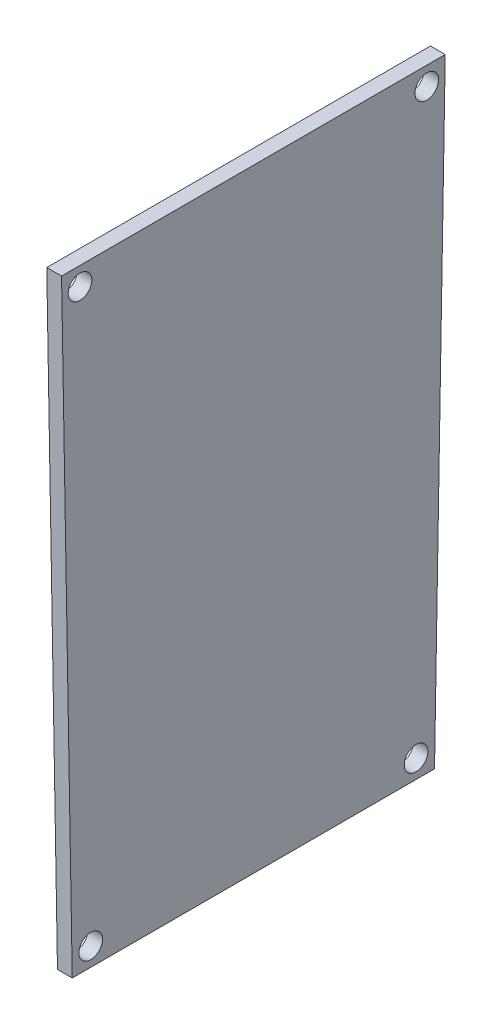
ISO-10303-21;
HEADER;
FILE_DESCRIPTION(('STEP AP214'),'2;1');
FILE_NAME('part.step','',(''),(''),'','','');
FILE_SCHEMA(('AUTOMOTIVE_DESIGN { 1 0 10303 214 1 1 1 1 }'));
ENDSEC;
DATA;
#1=APPLICATION_CONTEXT('core data for automotive mechanical design processes');
#2=APPLICATION_PROTOCOL_DEFINITION('international standard','automotive_design',2000,#1);
#3=PRODUCT_CONTEXT('',#1,'mechanical');
#4=PRODUCT('Part','Part','',(#3));
#5=PRODUCT_RELATED_PRODUCT_CATEGORY('part','',(#4));
#6=PRODUCT_DEFINITION_FORMATION('','',#4);
#7=PRODUCT_DEFINITION_CONTEXT('part definition',#1,'design');
#8=PRODUCT_DEFINITION('design','',#6,#7);
#9=PRODUCT_DEFINITION_SHAPE('','',#8);
#10=(LENGTH_UNIT() NAMED_UNIT(*) SI_UNIT(.MILLI.,.METRE.));
#11=(NAMED_UNIT(*) PLANE_ANGLE_UNIT() SI_UNIT($,.RADIAN.));
#12=(NAMED_UNIT(*) SI_UNIT($,.STERADIAN.) SOLID_ANGLE_UNIT());
#13=UNCERTAINTY_MEASURE_WITH_UNIT(LENGTH_MEASURE(1.E-05),#10,'distance_accuracy_value','');
#14=(GEOMETRIC_REPRESENTATION_CONTEXT(3) GLOBAL_UNCERTAINTY_ASSIGNED_CONTEXT((#13)) GLOBAL_UNIT_ASSIGNED_CONTEXT((#10,
#11,#12)) REPRESENTATION_CONTEXT('',''));
#15=CARTESIAN_POINT('',(0.,0.,0.));
#16=DIRECTION('',(0.,0.,1.));
#17=DIRECTION('',(1.,0.,0.));
#18=AXIS2_PLACEMENT_3D('',#15,#16,#17);
#19=CARTESIAN_POINT('',(50.7732847860139,110.032359225601,93.9540991206735));
#20=DIRECTION('',(0.,-0.0174524064372836,0.999847695156391));
#21=DIRECTION('',(0.,-0.999847695156391,-0.0174524064372836));
#22=AXIS2_PLACEMENT_3D('',#19,#20,#21);
#23=PLANE('',#22);
#24=DIRECTION('',(0.,-0.999847695156391,-0.0174524064372836));
#25=VECTOR('',#24,1.);
#26=CARTESIAN_POINT('',(52.7732847860139,110.032359225601,93.9540991206735));
#27=LINE('',#26,#25);
#28=CARTESIAN_POINT('',(52.7732847860139,110.032359225601,93.9540991206735));
#29=VERTEX_POINT('',#28);
#30=CARTESIAN_POINT('',(52.7732847860139,27.032359225601,92.5053287316314));
#31=VERTEX_POINT('',#30);
#32=EDGE_CURVE('E98',#29,#31,#27,.T.);
#33=ORIENTED_EDGE('',*,*,#32,.F.);
#34=DIRECTION('',(1.,0.,0.));
#35=VECTOR('',#34,1.);
#36=CARTESIAN_POINT('',(50.7732847860139,110.032359225601,93.9540991206735));
#37=LINE('',#36,#35);
#38=CARTESIAN_POINT('',(50.7732847860139,110.032359225601,93.9540991206735));
#39=VERTEX_POINT('',#38);
#40=EDGE_CURVE('E11',#39,#29,#37,.T.);
#41=ORIENTED_EDGE('',*,*,#40,.F.);
#42=DIRECTION('',(0.,-0.999847695156391,-0.0174524064372836));
#43=VECTOR('',#42,1.);
#44=CARTESIAN_POINT('',(50.7732847860139,110.032359225601,93.9540991206735));
#45=LINE('',#44,#43);
#46=CARTESIAN_POINT('',(50.7732847860139,27.032359225601,92.5053287316314));
#47=VERTEX_POINT('',#46);
#48=EDGE_CURVE('E91',#39,#47,#45,.T.);
#49=ORIENTED_EDGE('',*,*,#48,.T.);
#50=DIRECTION('',(1.,0.,0.));
#51=VECTOR('',#50,1.);
#52=CARTESIAN_POINT('',(50.7732847860139,27.032359225601,92.5053287316314));
#53=LINE('',#52,#51);
#54=EDGE_CURVE('E36',#47,#31,#53,.T.);
#55=ORIENTED_EDGE('',*,*,#54,.T.);
#56=EDGE_LOOP('',(#33,#41,#49,#55));
#57=FACE_BOUND('',#56,.T.);
#58=ADVANCED_FACE('F33',(#57),#23,.T.);
#59=CARTESIAN_POINT('',(50.7732847860139,110.032359225601,42.0251380047376));
#60=DIRECTION('',(0.,1.,0.));
#61=DIRECTION('',(0.,0.,1.));
#62=AXIS2_PLACEMENT_3D('',#59,#60,#61);
#63=PLANE('',#62);
#64=DIRECTION('',(0.,0.,1.));
#65=VECTOR('',#64,1.);
#66=CARTESIAN_POINT('',(52.7732847860139,110.032359225601,42.0251380047376));
#67=LINE('',#66,#65);
#68=CARTESIAN_POINT('',(52.7732847860139,110.032359225601,42.0251380047376));
#69=VERTEX_POINT('',#68);
#70=EDGE_CURVE('E93',#69,#29,#67,.T.);
#71=ORIENTED_EDGE('',*,*,#70,.F.);
#72=DIRECTION('',(1.,0.,0.));
#73=VECTOR('',#72,1.);
#74=CARTESIAN_POINT('',(50.7732847860139,110.032359225601,42.0251380047376));
#75=LINE('',#74,#73);
#76=CARTESIAN_POINT('',(50.7732847860139,110.032359225601,42.0251380047376));
#77=VERTEX_POINT('',#76);
#78=EDGE_CURVE('E42',#77,#69,#75,.T.);
#79=ORIENTED_EDGE('',*,*,#78,.F.);
#80=DIRECTION('',(0.,0.,1.));
#81=VECTOR('',#80,1.);
#82=CARTESIAN_POINT('',(50.7732847860139,110.032359225601,42.0251380047376));
#83=LINE('',#82,#81);
#84=EDGE_CURVE('E88',#77,#39,#83,.T.);
#85=ORIENTED_EDGE('',*,*,#84,.T.);
#86=ORIENTED_EDGE('',*,*,#40,.T.);
#87=EDGE_LOOP('',(#71,#79,#85,#86));
#88=FACE_BOUND('',#87,.T.);
#89=ADVANCED_FACE('F109',(#88),#63,.T.);
#90=CARTESIAN_POINT('',(50.7732847860139,27.032359225601,43.4739083937797));
#91=DIRECTION('',(0.,-0.0174524064372835,-0.999847695156391));
#92=DIRECTION('',(0.,0.999847695156391,-0.0174524064372835));
#93=AXIS2_PLACEMENT_3D('',#90,#91,#92);
#94=PLANE('',#93);
#95=DIRECTION('',(0.,0.999847695156391,-0.0174524064372835));
#96=VECTOR('',#95,1.);
#97=CARTESIAN_POINT('',(52.7732847860139,27.032359225601,43.4739083937797));
#98=LINE('',#97,#96);
#99=CARTESIAN_POINT('',(52.7732847860139,27.032359225601,43.4739083937797));
#100=VERTEX_POINT('',#99);
#101=EDGE_CURVE('E83',#100,#69,#98,.T.);
#102=ORIENTED_EDGE('',*,*,#101,.F.);
#103=DIRECTION('',(1.,0.,0.));
#104=VECTOR('',#103,1.);
#105=CARTESIAN_POINT('',(50.7732847860139,27.032359225601,43.4739083937797));
#106=LINE('',#105,#104);
#107=CARTESIAN_POINT('',(50.7732847860139,27.032359225601,43.4739083937797));
#108=VERTEX_POINT('',#107);
#109=EDGE_CURVE('E78',#108,#100,#106,.T.);
#110=ORIENTED_EDGE('',*,*,#109,.F.);
#111=DIRECTION('',(0.,0.999847695156391,-0.0174524064372835));
#112=VECTOR('',#111,1.);
#113=CARTESIAN_POINT('',(50.7732847860139,27.032359225601,43.4739083937797));
#114=LINE('',#113,#112);
#115=EDGE_CURVE('E81',#108,#77,#114,.T.);
#116=ORIENTED_EDGE('',*,*,#115,.T.);
#117=ORIENTED_EDGE('',*,*,#78,.T.);
#118=EDGE_LOOP('',(#102,#110,#116,#117));
#119=FACE_BOUND('',#118,.T.);
#120=ADVANCED_FACE('F80',(#119),#94,.T.);
#121=CARTESIAN_POINT('',(50.7732847860139,27.032359225601,92.5053287316314));
#122=DIRECTION('',(0.,-1.,0.));
#123=DIRECTION('',(0.,0.,-1.));
#124=AXIS2_PLACEMENT_3D('',#121,#122,#123);
#125=PLANE('',#124);
#126=DIRECTION('',(0.,0.,-1.));
#127=VECTOR('',#126,1.);
#128=CARTESIAN_POINT('',(52.7732847860139,27.032359225601,92.5053287316314));
#129=LINE('',#128,#127);
#130=EDGE_CURVE('E101',#31,#100,#129,.T.);
#131=ORIENTED_EDGE('',*,*,#130,.F.);
#132=ORIENTED_EDGE('',*,*,#54,.F.);
#133=DIRECTION('',(0.,0.,-1.));
#134=VECTOR('',#133,1.);
#135=CARTESIAN_POINT('',(50.7732847860139,27.032359225601,92.5053287316314));
#136=LINE('',#135,#134);
#137=EDGE_CURVE('E87',#47,#108,#136,.T.);
#138=ORIENTED_EDGE('',*,*,#137,.T.);
#139=ORIENTED_EDGE('',*,*,#109,.T.);
#140=EDGE_LOOP('',(#131,#132,#138,#139));
#141=FACE_BOUND('',#140,.T.);
#142=ADVANCED_FACE('F90',(#141),#125,.T.);
#143=CARTESIAN_POINT('',(50.7732847860139,0.,0.));
#144=DIRECTION('',(1.,0.,0.));
#145=DIRECTION('',(0.,0.,-1.));
#146=AXIS2_PLACEMENT_3D('',#143,#144,#145);
#147=PLANE('',#146);
#148=CARTESIAN_POINT('',(50.7732847860139,107.532359225601,91.4540991206735));
#149=DIRECTION('',(1.,0.,0.));
#150=DIRECTION('',(0.,0.,-1.));
#151=AXIS2_PLACEMENT_3D('',#148,#149,#150);
#152=CIRCLE('',#151,1.60000000000001);
#153=CARTESIAN_POINT('',(50.7732847860139,107.532359225601,89.8540991206735));
#154=VERTEX_POINT('',#153);
#155=EDGE_CURVE('E160',#154,#154,#152,.T.);
#156=ORIENTED_EDGE('',*,*,#155,.T.);
#157=EDGE_LOOP('',(#156));
#158=FACE_BOUND('',#157,.T.);
#159=CARTESIAN_POINT('',(50.7732847860139,29.532359225601,45.9739083937797));
#160=DIRECTION('',(1.,0.,0.));
#161=DIRECTION('',(0.,0.,-1.));
#162=AXIS2_PLACEMENT_3D('',#159,#160,#161);
#163=CIRCLE('',#162,1.6);
#164=CARTESIAN_POINT('',(50.7732847860139,29.532359225601,44.3739083937797));
#165=VERTEX_POINT('',#164);
#166=EDGE_CURVE('E166',#165,#165,#163,.T.);
#167=ORIENTED_EDGE('',*,*,#166,.T.);
#168=EDGE_LOOP('',(#167));
#169=FACE_BOUND('',#168,.T.);
#170=CARTESIAN_POINT('',(50.7732847860139,29.532359225601,90.0053287316315));
#171=DIRECTION('',(1.,0.,0.));
#172=DIRECTION('',(0.,0.,-1.));
#173=AXIS2_PLACEMENT_3D('',#170,#171,#172);
#174=CIRCLE('',#173,1.59999999999999);
#175=CARTESIAN_POINT('',(50.7732847860139,29.532359225601,88.4053287316315));
#176=VERTEX_POINT('',#175);
#177=EDGE_CURVE('E151',#176,#176,#174,.T.);
#178=ORIENTED_EDGE('',*,*,#177,.T.);
#179=EDGE_LOOP('',(#178));
#180=FACE_BOUND('',#179,.T.);
#181=CARTESIAN_POINT('',(50.7732847860139,107.532359225601,44.5251380047376));
#182=DIRECTION('',(1.,0.,0.));
#183=DIRECTION('',(0.,0.,-1.));
#184=AXIS2_PLACEMENT_3D('',#181,#182,#183);
#185=CIRCLE('',#184,1.60000000000001);
#186=CARTESIAN_POINT('',(50.7732847860139,107.532359225601,42.9251380047376));
#187=VERTEX_POINT('',#186);
#188=EDGE_CURVE('E102',#187,#187,#185,.T.);
#189=ORIENTED_EDGE('',*,*,#188,.T.);
#190=EDGE_LOOP('',(#189));
#191=FACE_BOUND('',#190,.T.);
#192=ORIENTED_EDGE('',*,*,#48,.F.);
#193=ORIENTED_EDGE('',*,*,#84,.F.);
#194=ORIENTED_EDGE('',*,*,#115,.F.);
#195=ORIENTED_EDGE('',*,*,#137,.F.);
#196=EDGE_LOOP('',(#192,#193,#194,#195));
#197=FACE_BOUND('',#196,.T.);
#198=ADVANCED_FACE('F86',(#158,#169,#180,#191,#197),#147,.F.);
#199=CARTESIAN_POINT('',(52.7732847860139,0.,0.));
#200=DIRECTION('',(1.,0.,0.));
#201=DIRECTION('',(0.,0.,-1.));
#202=AXIS2_PLACEMENT_3D('',#199,#200,#201);
#203=PLANE('',#202);
#204=CARTESIAN_POINT('',(52.7732847860139,107.532359225601,91.4540991206735));
#205=DIRECTION('',(1.,0.,0.));
#206=DIRECTION('',(0.,0.,-1.));
#207=AXIS2_PLACEMENT_3D('',#204,#205,#206);
#208=CIRCLE('',#207,1.60000000000001);
#209=CARTESIAN_POINT('',(52.7732847860139,107.532359225601,89.8540991206735));
#210=VERTEX_POINT('',#209);
#211=EDGE_CURVE('E163',#210,#210,#208,.T.);
#212=ORIENTED_EDGE('',*,*,#211,.F.);
#213=EDGE_LOOP('',(#212));
#214=FACE_BOUND('',#213,.T.);
#215=CARTESIAN_POINT('',(52.7732847860139,29.532359225601,45.9739083937797));
#216=DIRECTION('',(1.,0.,0.));
#217=DIRECTION('',(0.,0.,-1.));
#218=AXIS2_PLACEMENT_3D('',#215,#216,#217);
#219=CIRCLE('',#218,1.6);
#220=CARTESIAN_POINT('',(52.7732847860139,29.532359225601,44.3739083937797));
#221=VERTEX_POINT('',#220);
#222=EDGE_CURVE('E157',#221,#221,#219,.T.);
#223=ORIENTED_EDGE('',*,*,#222,.F.);
#224=EDGE_LOOP('',(#223));
#225=FACE_BOUND('',#224,.T.);
#226=CARTESIAN_POINT('',(52.7732847860139,29.532359225601,90.0053287316315));
#227=DIRECTION('',(1.,0.,0.));
#228=DIRECTION('',(0.,0.,-1.));
#229=AXIS2_PLACEMENT_3D('',#226,#227,#228);
#230=CIRCLE('',#229,1.59999999999999);
#231=CARTESIAN_POINT('',(52.7732847860139,29.532359225601,88.4053287316315));
#232=VERTEX_POINT('',#231);
#233=EDGE_CURVE('E154',#232,#232,#230,.T.);
#234=ORIENTED_EDGE('',*,*,#233,.F.);
#235=EDGE_LOOP('',(#234));
#236=FACE_BOUND('',#235,.T.);
#237=CARTESIAN_POINT('',(52.7732847860139,107.532359225601,44.5251380047376));
#238=DIRECTION('',(1.,0.,0.));
#239=DIRECTION('',(0.,0.,-1.));
#240=AXIS2_PLACEMENT_3D('',#237,#238,#239);
#241=CIRCLE('',#240,1.60000000000001);
#242=CARTESIAN_POINT('',(52.7732847860139,107.532359225601,42.9251380047376));
#243=VERTEX_POINT('',#242);
#244=EDGE_CURVE('E162',#243,#243,#241,.T.);
#245=ORIENTED_EDGE('',*,*,#244,.F.);
#246=EDGE_LOOP('',(#245));
#247=FACE_BOUND('',#246,.T.);
#248=ORIENTED_EDGE('',*,*,#32,.T.);
#249=ORIENTED_EDGE('',*,*,#130,.T.);
#250=ORIENTED_EDGE('',*,*,#101,.T.);
#251=ORIENTED_EDGE('',*,*,#70,.T.);
#252=EDGE_LOOP('',(#248,#249,#250,#251));
#253=FACE_BOUND('',#252,.T.);
#254=ADVANCED_FACE('F108',(#214,#225,#236,#247,#253),#203,.T.);
#255=CARTESIAN_POINT('',(50.7732847860139,107.532359225601,44.5251380047376));
#256=DIRECTION('',(1.,0.,0.));
#257=DIRECTION('',(0.,0.,-1.));
#258=AXIS2_PLACEMENT_3D('',#255,#256,#257);
#259=CYLINDRICAL_SURFACE('',#258,1.60000000000001);
#260=ORIENTED_EDGE('',*,*,#188,.F.);
#261=EDGE_LOOP('',(#260));
#262=FACE_BOUND('',#261,.T.);
#263=ORIENTED_EDGE('',*,*,#244,.T.);
#264=EDGE_LOOP('',(#263));
#265=FACE_BOUND('',#264,.T.);
#266=ADVANCED_FACE('F127',(#262,#265),#259,.F.);
#267=CARTESIAN_POINT('',(50.7732847860139,29.532359225601,90.0053287316315));
#268=DIRECTION('',(1.,0.,0.));
#269=DIRECTION('',(0.,0.,-1.));
#270=AXIS2_PLACEMENT_3D('',#267,#268,#269);
#271=CYLINDRICAL_SURFACE('',#270,1.59999999999999);
#272=ORIENTED_EDGE('',*,*,#177,.F.);
#273=EDGE_LOOP('',(#272));
#274=FACE_BOUND('',#273,.T.);
#275=ORIENTED_EDGE('',*,*,#233,.T.);
#276=EDGE_LOOP('',(#275));
#277=FACE_BOUND('',#276,.T.);
#278=ADVANCED_FACE('F134',(#274,#277),#271,.F.);
#279=CARTESIAN_POINT('',(50.7732847860139,29.532359225601,45.9739083937797));
#280=DIRECTION('',(1.,0.,0.));
#281=DIRECTION('',(0.,0.,-1.));
#282=AXIS2_PLACEMENT_3D('',#279,#280,#281);
#283=CYLINDRICAL_SURFACE('',#282,1.6);
#284=ORIENTED_EDGE('',*,*,#166,.F.);
#285=EDGE_LOOP('',(#284));
#286=FACE_BOUND('',#285,.T.);
#287=ORIENTED_EDGE('',*,*,#222,.T.);
#288=EDGE_LOOP('',(#287));
#289=FACE_BOUND('',#288,.T.);
#290=ADVANCED_FACE('F136',(#286,#289),#283,.F.);
#291=CARTESIAN_POINT('',(50.7732847860139,107.532359225601,91.4540991206735));
#292=DIRECTION('',(1.,0.,0.));
#293=DIRECTION('',(0.,0.,-1.));
#294=AXIS2_PLACEMENT_3D('',#291,#292,#293);
#295=CYLINDRICAL_SURFACE('',#294,1.60000000000001);
#296=ORIENTED_EDGE('',*,*,#155,.F.);
#297=EDGE_LOOP('',(#296));
#298=FACE_BOUND('',#297,.T.);
#299=ORIENTED_EDGE('',*,*,#211,.T.);
#300=EDGE_LOOP('',(#299));
#301=FACE_BOUND('',#300,.T.);
#302=ADVANCED_FACE('F139',(#298,#301),#295,.F.);
#303=CLOSED_SHELL('',(#58,#89,#120,#142,#198,#254,#266,#278,#290,#302));
#304=MANIFOLD_SOLID_BREP('B2',#303);
#305=ADVANCED_BREP_SHAPE_REPRESENTATION('',(#18,#304),#14);
#306=SHAPE_DEFINITION_REPRESENTATION(#9,#305);
ENDSEC;
END-ISO-10303-21;
